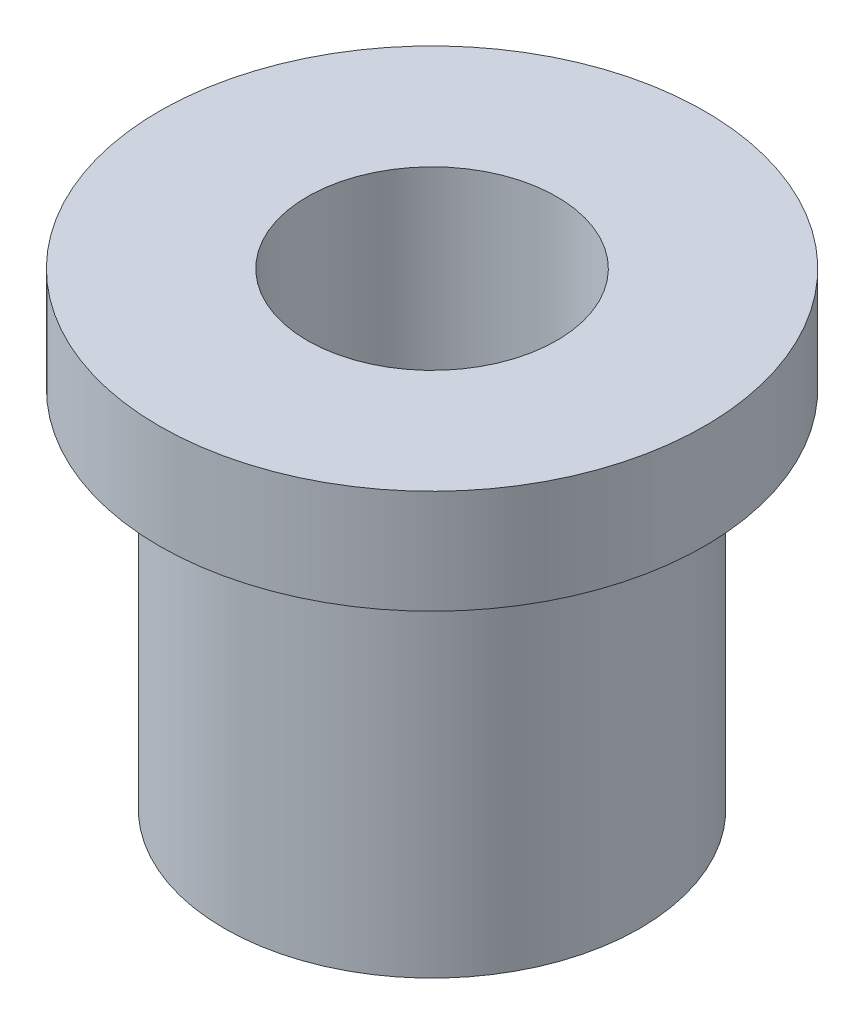
ISO-10303-21;
HEADER;
FILE_DESCRIPTION(('STEP AP214'),'2;1');
FILE_NAME('part.step','',(''),(''),'','','');
FILE_SCHEMA(('AUTOMOTIVE_DESIGN { 1 0 10303 214 1 1 1 1 }'));
ENDSEC;
DATA;
#1=APPLICATION_CONTEXT('core data for automotive mechanical design processes');
#2=APPLICATION_PROTOCOL_DEFINITION('international standard','automotive_design',2000,#1);
#3=PRODUCT_CONTEXT('',#1,'mechanical');
#4=PRODUCT('Part','Part','',(#3));
#5=PRODUCT_RELATED_PRODUCT_CATEGORY('part','',(#4));
#6=PRODUCT_DEFINITION_FORMATION('','',#4);
#7=PRODUCT_DEFINITION_CONTEXT('part definition',#1,'design');
#8=PRODUCT_DEFINITION('design','',#6,#7);
#9=PRODUCT_DEFINITION_SHAPE('','',#8);
#10=(LENGTH_UNIT() NAMED_UNIT(*) SI_UNIT(.MILLI.,.METRE.));
#11=(NAMED_UNIT(*) PLANE_ANGLE_UNIT() SI_UNIT($,.RADIAN.));
#12=(NAMED_UNIT(*) SI_UNIT($,.STERADIAN.) SOLID_ANGLE_UNIT());
#13=UNCERTAINTY_MEASURE_WITH_UNIT(LENGTH_MEASURE(1.E-05),#10,'distance_accuracy_value','');
#14=(GEOMETRIC_REPRESENTATION_CONTEXT(3) GLOBAL_UNCERTAINTY_ASSIGNED_CONTEXT((#13)) GLOBAL_UNIT_ASSIGNED_CONTEXT((#10,
#11,#12)) REPRESENTATION_CONTEXT('',''));
#15=CARTESIAN_POINT('',(0.,0.,0.));
#16=DIRECTION('',(0.,0.,1.));
#17=DIRECTION('',(1.,0.,0.));
#18=AXIS2_PLACEMENT_3D('',#15,#16,#17);
#19=CARTESIAN_POINT('',(0.,9.,0.));
#20=DIRECTION('',(0.,-1.,0.));
#21=DIRECTION('',(0.,0.,-1.));
#22=AXIS2_PLACEMENT_3D('',#19,#20,#21);
#23=CYLINDRICAL_SURFACE('',#22,4.);
#24=CARTESIAN_POINT('',(0.,0.,0.));
#25=DIRECTION('',(0.,1.,0.));
#26=DIRECTION('',(0.,0.,1.));
#27=AXIS2_PLACEMENT_3D('',#24,#25,#26);
#28=CIRCLE('',#27,4.);
#29=CARTESIAN_POINT('',(0.,0.,4.));
#30=VERTEX_POINT('',#29);
#31=EDGE_CURVE('E40',#30,#30,#28,.T.);
#32=ORIENTED_EDGE('',*,*,#31,.T.);
#33=EDGE_LOOP('',(#32));
#34=FACE_BOUND('',#33,.T.);
#35=CARTESIAN_POINT('',(0.,7.,0.));
#36=DIRECTION('',(0.,1.,0.));
#37=DIRECTION('',(0.,0.,1.));
#38=AXIS2_PLACEMENT_3D('',#35,#36,#37);
#39=CIRCLE('',#38,4.);
#40=CARTESIAN_POINT('',(0.,7.,4.));
#41=VERTEX_POINT('',#40);
#42=EDGE_CURVE('E10',#41,#41,#39,.T.);
#43=ORIENTED_EDGE('',*,*,#42,.F.);
#44=EDGE_LOOP('',(#43));
#45=FACE_BOUND('',#44,.T.);
#46=ADVANCED_FACE('F37',(#34,#45),#23,.T.);
#47=CARTESIAN_POINT('',(0.,9.,0.));
#48=DIRECTION('',(0.,1.,0.));
#49=DIRECTION('',(0.,0.,1.));
#50=AXIS2_PLACEMENT_3D('',#47,#48,#49);
#51=PLANE('',#50);
#52=CARTESIAN_POINT('',(0.,9.,0.));
#53=DIRECTION('',(0.,1.,0.));
#54=DIRECTION('',(0.,0.,1.));
#55=AXIS2_PLACEMENT_3D('',#52,#53,#54);
#56=CIRCLE('',#55,2.4);
#57=CARTESIAN_POINT('',(0.,9.,2.4));
#58=VERTEX_POINT('',#57);
#59=EDGE_CURVE('E48',#58,#58,#56,.T.);
#60=ORIENTED_EDGE('',*,*,#59,.F.);
#61=EDGE_LOOP('',(#60));
#62=FACE_BOUND('',#61,.T.);
#63=CARTESIAN_POINT('',(0.,9.,0.));
#64=DIRECTION('',(0.,1.,0.));
#65=DIRECTION('',(0.,0.,1.));
#66=AXIS2_PLACEMENT_3D('',#63,#64,#65);
#67=CIRCLE('',#66,5.25);
#68=CARTESIAN_POINT('',(0.,9.,5.25));
#69=VERTEX_POINT('',#68);
#70=EDGE_CURVE('E51',#69,#69,#67,.T.);
#71=ORIENTED_EDGE('',*,*,#70,.T.);
#72=EDGE_LOOP('',(#71));
#73=FACE_BOUND('',#72,.T.);
#74=ADVANCED_FACE('F65',(#62,#73),#51,.T.);
#75=CARTESIAN_POINT('',(0.,0.,0.));
#76=DIRECTION('',(0.,1.,0.));
#77=DIRECTION('',(0.,0.,1.));
#78=AXIS2_PLACEMENT_3D('',#75,#76,#77);
#79=PLANE('',#78);
#80=ORIENTED_EDGE('',*,*,#31,.F.);
#81=EDGE_LOOP('',(#80));
#82=FACE_BOUND('',#81,.T.);
#83=CARTESIAN_POINT('',(0.,0.,0.));
#84=DIRECTION('',(0.,1.,0.));
#85=DIRECTION('',(0.,0.,1.));
#86=AXIS2_PLACEMENT_3D('',#83,#84,#85);
#87=CIRCLE('',#86,2.4);
#88=CARTESIAN_POINT('',(0.,0.,2.4));
#89=VERTEX_POINT('',#88);
#90=EDGE_CURVE('E54',#89,#89,#87,.T.);
#91=ORIENTED_EDGE('',*,*,#90,.T.);
#92=EDGE_LOOP('',(#91));
#93=FACE_BOUND('',#92,.T.);
#94=ADVANCED_FACE('F84',(#82,#93),#79,.F.);
#95=CARTESIAN_POINT('',(0.,9.,0.));
#96=DIRECTION('',(0.,-1.,0.));
#97=DIRECTION('',(0.,0.,-1.));
#98=AXIS2_PLACEMENT_3D('',#95,#96,#97);
#99=CYLINDRICAL_SURFACE('',#98,2.4);
#100=ORIENTED_EDGE('',*,*,#59,.T.);
#101=EDGE_LOOP('',(#100));
#102=FACE_BOUND('',#101,.T.);
#103=ORIENTED_EDGE('',*,*,#90,.F.);
#104=EDGE_LOOP('',(#103));
#105=FACE_BOUND('',#104,.T.);
#106=ADVANCED_FACE('F74',(#102,#105),#99,.F.);
#107=CARTESIAN_POINT('',(0.,7.,0.));
#108=DIRECTION('',(0.,1.,0.));
#109=DIRECTION('',(0.,0.,1.));
#110=AXIS2_PLACEMENT_3D('',#107,#108,#109);
#111=PLANE('',#110);
#112=CARTESIAN_POINT('',(0.,7.,0.));
#113=DIRECTION('',(0.,1.,0.));
#114=DIRECTION('',(0.,0.,1.));
#115=AXIS2_PLACEMENT_3D('',#112,#113,#114);
#116=CIRCLE('',#115,5.25);
#117=CARTESIAN_POINT('',(0.,7.,5.25));
#118=VERTEX_POINT('',#117);
#119=EDGE_CURVE('E56',#118,#118,#116,.T.);
#120=ORIENTED_EDGE('',*,*,#119,.F.);
#121=EDGE_LOOP('',(#120));
#122=FACE_BOUND('',#121,.T.);
#123=ORIENTED_EDGE('',*,*,#42,.T.);
#124=EDGE_LOOP('',(#123));
#125=FACE_BOUND('',#124,.T.);
#126=ADVANCED_FACE('F69',(#122,#125),#111,.F.);
#127=CARTESIAN_POINT('',(0.,7.,0.));
#128=DIRECTION('',(0.,1.,0.));
#129=DIRECTION('',(0.,0.,1.));
#130=AXIS2_PLACEMENT_3D('',#127,#128,#129);
#131=CYLINDRICAL_SURFACE('',#130,5.25);
#132=ORIENTED_EDGE('',*,*,#119,.T.);
#133=EDGE_LOOP('',(#132));
#134=FACE_BOUND('',#133,.T.);
#135=ORIENTED_EDGE('',*,*,#70,.F.);
#136=EDGE_LOOP('',(#135));
#137=FACE_BOUND('',#136,.T.);
#138=ADVANCED_FACE('F67',(#134,#137),#131,.T.);
#139=CLOSED_SHELL('',(#46,#74,#94,#106,#126,#138));
#140=MANIFOLD_SOLID_BREP('B2',#139);
#141=ADVANCED_BREP_SHAPE_REPRESENTATION('',(#18,#140),#14);
#142=SHAPE_DEFINITION_REPRESENTATION(#9,#141);
ENDSEC;
END-ISO-10303-21;
